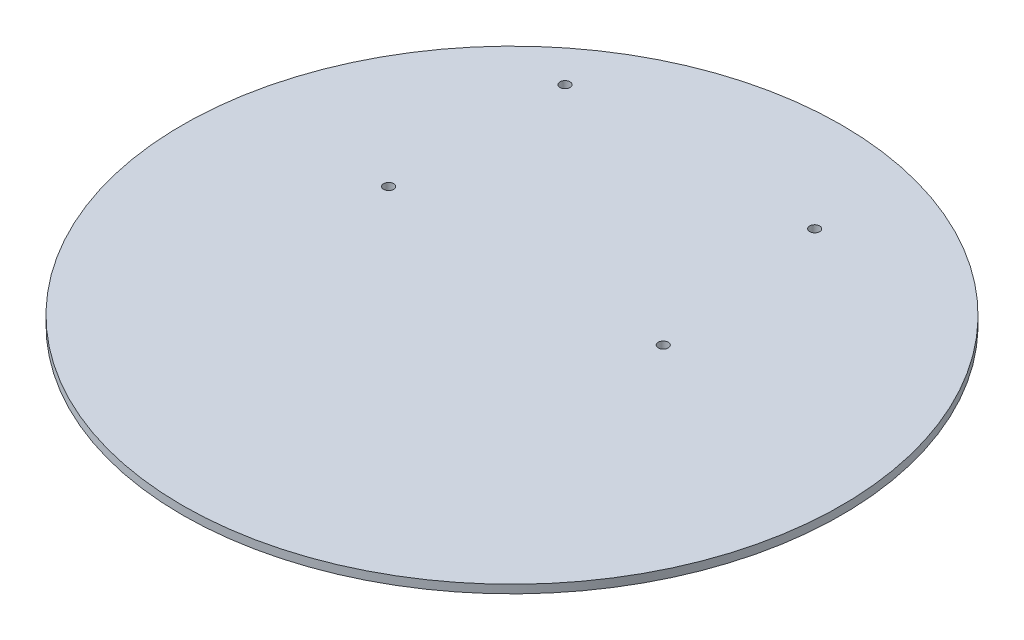
ISO-10303-21;
HEADER;
FILE_DESCRIPTION(('STEP AP214'),'2;1');
FILE_NAME('part.step','',(''),(''),'','','');
FILE_SCHEMA(('AUTOMOTIVE_DESIGN { 1 0 10303 214 1 1 1 1 }'));
ENDSEC;
DATA;
#1=APPLICATION_CONTEXT('core data for automotive mechanical design processes');
#2=APPLICATION_PROTOCOL_DEFINITION('international standard','automotive_design',2000,#1);
#3=PRODUCT_CONTEXT('',#1,'mechanical');
#4=PRODUCT('Part','Part','',(#3));
#5=PRODUCT_RELATED_PRODUCT_CATEGORY('part','',(#4));
#6=PRODUCT_DEFINITION_FORMATION('','',#4);
#7=PRODUCT_DEFINITION_CONTEXT('part definition',#1,'design');
#8=PRODUCT_DEFINITION('design','',#6,#7);
#9=PRODUCT_DEFINITION_SHAPE('','',#8);
#10=(LENGTH_UNIT() NAMED_UNIT(*) SI_UNIT(.MILLI.,.METRE.));
#11=(NAMED_UNIT(*) PLANE_ANGLE_UNIT() SI_UNIT($,.RADIAN.));
#12=(NAMED_UNIT(*) SI_UNIT($,.STERADIAN.) SOLID_ANGLE_UNIT());
#13=UNCERTAINTY_MEASURE_WITH_UNIT(LENGTH_MEASURE(1.E-05),#10,'distance_accuracy_value','');
#14=(GEOMETRIC_REPRESENTATION_CONTEXT(3) GLOBAL_UNCERTAINTY_ASSIGNED_CONTEXT((#13)) GLOBAL_UNIT_ASSIGNED_CONTEXT((#10,
#11,#12)) REPRESENTATION_CONTEXT('',''));
#15=CARTESIAN_POINT('',(0.,0.,0.));
#16=DIRECTION('',(0.,0.,1.));
#17=DIRECTION('',(1.,0.,0.));
#18=AXIS2_PLACEMENT_3D('',#15,#16,#17);
#19=CARTESIAN_POINT('',(0.,2.5,0.));
#20=DIRECTION('',(0.,-1.,0.));
#21=DIRECTION('',(0.,0.,-1.));
#22=AXIS2_PLACEMENT_3D('',#19,#20,#21);
#23=CYLINDRICAL_SURFACE('',#22,99.);
#24=CARTESIAN_POINT('',(0.,2.5,0.));
#25=DIRECTION('',(0.,1.,0.));
#26=DIRECTION('',(0.,0.,1.));
#27=AXIS2_PLACEMENT_3D('',#24,#25,#26);
#28=CIRCLE('',#27,99.);
#29=CARTESIAN_POINT('',(0.,2.5,99.));
#30=VERTEX_POINT('',#29);
#31=EDGE_CURVE('E10',#30,#30,#28,.T.);
#32=ORIENTED_EDGE('',*,*,#31,.F.);
#33=EDGE_LOOP('',(#32));
#34=FACE_BOUND('',#33,.T.);
#35=CARTESIAN_POINT('',(0.,0.,0.));
#36=DIRECTION('',(0.,1.,0.));
#37=DIRECTION('',(0.,0.,1.));
#38=AXIS2_PLACEMENT_3D('',#35,#36,#37);
#39=CIRCLE('',#38,99.);
#40=CARTESIAN_POINT('',(0.,0.,99.));
#41=VERTEX_POINT('',#40);
#42=EDGE_CURVE('E40',#41,#41,#39,.T.);
#43=ORIENTED_EDGE('',*,*,#42,.T.);
#44=EDGE_LOOP('',(#43));
#45=FACE_BOUND('',#44,.T.);
#46=ADVANCED_FACE('F37',(#34,#45),#23,.T.);
#47=CARTESIAN_POINT('',(0.,2.5,0.));
#48=DIRECTION('',(0.,1.,0.));
#49=DIRECTION('',(0.,0.,1.));
#50=AXIS2_PLACEMENT_3D('',#47,#48,#49);
#51=PLANE('',#50);
#52=ORIENTED_EDGE('',*,*,#31,.T.);
#53=EDGE_LOOP('',(#52));
#54=FACE_BOUND('',#53,.T.);
#55=CARTESIAN_POINT('',(30.4885118604404,2.5,-14.9417083289012));
#56=DIRECTION('',(0.,1.,0.));
#57=DIRECTION('',(0.,0.,1.));
#58=AXIS2_PLACEMENT_3D('',#55,#56,#57);
#59=CIRCLE('',#58,1.5);
#60=CARTESIAN_POINT('',(30.4885118604404,2.5,-13.4417083289012));
#61=VERTEX_POINT('',#60);
#62=EDGE_CURVE('E59',#61,#61,#59,.T.);
#63=ORIENTED_EDGE('',*,*,#62,.F.);
#64=EDGE_LOOP('',(#63));
#65=FACE_BOUND('',#64,.T.);
#66=CARTESIAN_POINT('',(-52.0114881395596,2.5,-14.9417083289012));
#67=DIRECTION('',(0.,1.,0.));
#68=DIRECTION('',(0.,0.,1.));
#69=AXIS2_PLACEMENT_3D('',#66,#67,#68);
#70=CIRCLE('',#69,1.5);
#71=CARTESIAN_POINT('',(-52.0114881395596,2.5,-13.4417083289012));
#72=VERTEX_POINT('',#71);
#73=EDGE_CURVE('E56',#72,#72,#70,.T.);
#74=ORIENTED_EDGE('',*,*,#73,.F.);
#75=EDGE_LOOP('',(#74));
#76=FACE_BOUND('',#75,.T.);
#77=CARTESIAN_POINT('',(-52.0114881395596,2.5,-67.9417083289012));
#78=DIRECTION('',(0.,1.,0.));
#79=DIRECTION('',(0.,0.,1.));
#80=AXIS2_PLACEMENT_3D('',#77,#78,#79);
#81=CIRCLE('',#80,1.5);
#82=CARTESIAN_POINT('',(-52.0114881395596,2.5,-66.4417083289012));
#83=VERTEX_POINT('',#82);
#84=EDGE_CURVE('E53',#83,#83,#81,.T.);
#85=ORIENTED_EDGE('',*,*,#84,.F.);
#86=EDGE_LOOP('',(#85));
#87=FACE_BOUND('',#86,.T.);
#88=CARTESIAN_POINT('',(22.9885118604404,2.5,-67.9417083289012));
#89=DIRECTION('',(0.,1.,0.));
#90=DIRECTION('',(0.,0.,1.));
#91=AXIS2_PLACEMENT_3D('',#88,#89,#90);
#92=CIRCLE('',#91,1.5);
#93=CARTESIAN_POINT('',(22.9885118604404,2.5,-66.4417083289012));
#94=VERTEX_POINT('',#93);
#95=EDGE_CURVE('E49',#94,#94,#92,.T.);
#96=ORIENTED_EDGE('',*,*,#95,.F.);
#97=EDGE_LOOP('',(#96));
#98=FACE_BOUND('',#97,.T.);
#99=ADVANCED_FACE('F83',(#54,#65,#76,#87,#98),#51,.T.);
#100=CARTESIAN_POINT('',(0.,0.,0.));
#101=DIRECTION('',(0.,1.,0.));
#102=DIRECTION('',(0.,0.,1.));
#103=AXIS2_PLACEMENT_3D('',#100,#101,#102);
#104=PLANE('',#103);
#105=ORIENTED_EDGE('',*,*,#42,.F.);
#106=EDGE_LOOP('',(#105));
#107=FACE_BOUND('',#106,.T.);
#108=CARTESIAN_POINT('',(30.4885118604404,0.,-14.9417083289012));
#109=DIRECTION('',(0.,1.,0.));
#110=DIRECTION('',(0.,0.,1.));
#111=AXIS2_PLACEMENT_3D('',#108,#109,#110);
#112=CIRCLE('',#111,1.5);
#113=CARTESIAN_POINT('',(30.4885118604404,0.,-13.4417083289012));
#114=VERTEX_POINT('',#113);
#115=EDGE_CURVE('E52',#114,#114,#112,.T.);
#116=ORIENTED_EDGE('',*,*,#115,.T.);
#117=EDGE_LOOP('',(#116));
#118=FACE_BOUND('',#117,.T.);
#119=CARTESIAN_POINT('',(-52.0114881395596,0.,-14.9417083289012));
#120=DIRECTION('',(0.,1.,0.));
#121=DIRECTION('',(0.,0.,1.));
#122=AXIS2_PLACEMENT_3D('',#119,#120,#121);
#123=CIRCLE('',#122,1.5);
#124=CARTESIAN_POINT('',(-52.0114881395596,0.,-13.4417083289012));
#125=VERTEX_POINT('',#124);
#126=EDGE_CURVE('E67',#125,#125,#123,.T.);
#127=ORIENTED_EDGE('',*,*,#126,.T.);
#128=EDGE_LOOP('',(#127));
#129=FACE_BOUND('',#128,.T.);
#130=CARTESIAN_POINT('',(-52.0114881395596,0.,-67.9417083289012));
#131=DIRECTION('',(0.,1.,0.));
#132=DIRECTION('',(0.,0.,1.));
#133=AXIS2_PLACEMENT_3D('',#130,#131,#132);
#134=CIRCLE('',#133,1.5);
#135=CARTESIAN_POINT('',(-52.0114881395596,0.,-66.4417083289012));
#136=VERTEX_POINT('',#135);
#137=EDGE_CURVE('E64',#136,#136,#134,.T.);
#138=ORIENTED_EDGE('',*,*,#137,.T.);
#139=EDGE_LOOP('',(#138));
#140=FACE_BOUND('',#139,.T.);
#141=CARTESIAN_POINT('',(22.9885118604404,0.,-67.9417083289012));
#142=DIRECTION('',(0.,1.,0.));
#143=DIRECTION('',(0.,0.,1.));
#144=AXIS2_PLACEMENT_3D('',#141,#142,#143);
#145=CIRCLE('',#144,1.5);
#146=CARTESIAN_POINT('',(22.9885118604404,0.,-66.4417083289012));
#147=VERTEX_POINT('',#146);
#148=EDGE_CURVE('E47',#147,#147,#145,.T.);
#149=ORIENTED_EDGE('',*,*,#148,.T.);
#150=EDGE_LOOP('',(#149));
#151=FACE_BOUND('',#150,.T.);
#152=ADVANCED_FACE('F73',(#107,#118,#129,#140,#151),#104,.F.);
#153=CARTESIAN_POINT('',(22.9885118604404,0.,-67.9417083289012));
#154=DIRECTION('',(0.,1.,0.));
#155=DIRECTION('',(0.,0.,1.));
#156=AXIS2_PLACEMENT_3D('',#153,#154,#155);
#157=CYLINDRICAL_SURFACE('',#156,1.5);
#158=ORIENTED_EDGE('',*,*,#148,.F.);
#159=EDGE_LOOP('',(#158));
#160=FACE_BOUND('',#159,.T.);
#161=ORIENTED_EDGE('',*,*,#95,.T.);
#162=EDGE_LOOP('',(#161));
#163=FACE_BOUND('',#162,.T.);
#164=ADVANCED_FACE('F93',(#160,#163),#157,.F.);
#165=CARTESIAN_POINT('',(-52.0114881395596,0.,-67.9417083289012));
#166=DIRECTION('',(0.,1.,0.));
#167=DIRECTION('',(0.,0.,1.));
#168=AXIS2_PLACEMENT_3D('',#165,#166,#167);
#169=CYLINDRICAL_SURFACE('',#168,1.5);
#170=ORIENTED_EDGE('',*,*,#137,.F.);
#171=EDGE_LOOP('',(#170));
#172=FACE_BOUND('',#171,.T.);
#173=ORIENTED_EDGE('',*,*,#84,.T.);
#174=EDGE_LOOP('',(#173));
#175=FACE_BOUND('',#174,.T.);
#176=ADVANCED_FACE('F95',(#172,#175),#169,.F.);
#177=CARTESIAN_POINT('',(-52.0114881395596,0.,-14.9417083289012));
#178=DIRECTION('',(0.,1.,0.));
#179=DIRECTION('',(0.,0.,1.));
#180=AXIS2_PLACEMENT_3D('',#177,#178,#179);
#181=CYLINDRICAL_SURFACE('',#180,1.5);
#182=ORIENTED_EDGE('',*,*,#126,.F.);
#183=EDGE_LOOP('',(#182));
#184=FACE_BOUND('',#183,.T.);
#185=ORIENTED_EDGE('',*,*,#73,.T.);
#186=EDGE_LOOP('',(#185));
#187=FACE_BOUND('',#186,.T.);
#188=ADVANCED_FACE('F79',(#184,#187),#181,.F.);
#189=CARTESIAN_POINT('',(30.4885118604404,0.,-14.9417083289012));
#190=DIRECTION('',(0.,1.,0.));
#191=DIRECTION('',(0.,0.,1.));
#192=AXIS2_PLACEMENT_3D('',#189,#190,#191);
#193=CYLINDRICAL_SURFACE('',#192,1.5);
#194=ORIENTED_EDGE('',*,*,#115,.F.);
#195=EDGE_LOOP('',(#194));
#196=FACE_BOUND('',#195,.T.);
#197=ORIENTED_EDGE('',*,*,#62,.T.);
#198=EDGE_LOOP('',(#197));
#199=FACE_BOUND('',#198,.T.);
#200=ADVANCED_FACE('F76',(#196,#199),#193,.F.);
#201=CLOSED_SHELL('',(#46,#99,#152,#164,#176,#188,#200));
#202=MANIFOLD_SOLID_BREP('B2',#201);
#203=ADVANCED_BREP_SHAPE_REPRESENTATION('',(#18,#202),#14);
#204=SHAPE_DEFINITION_REPRESENTATION(#9,#203);
ENDSEC;
END-ISO-10303-21;
